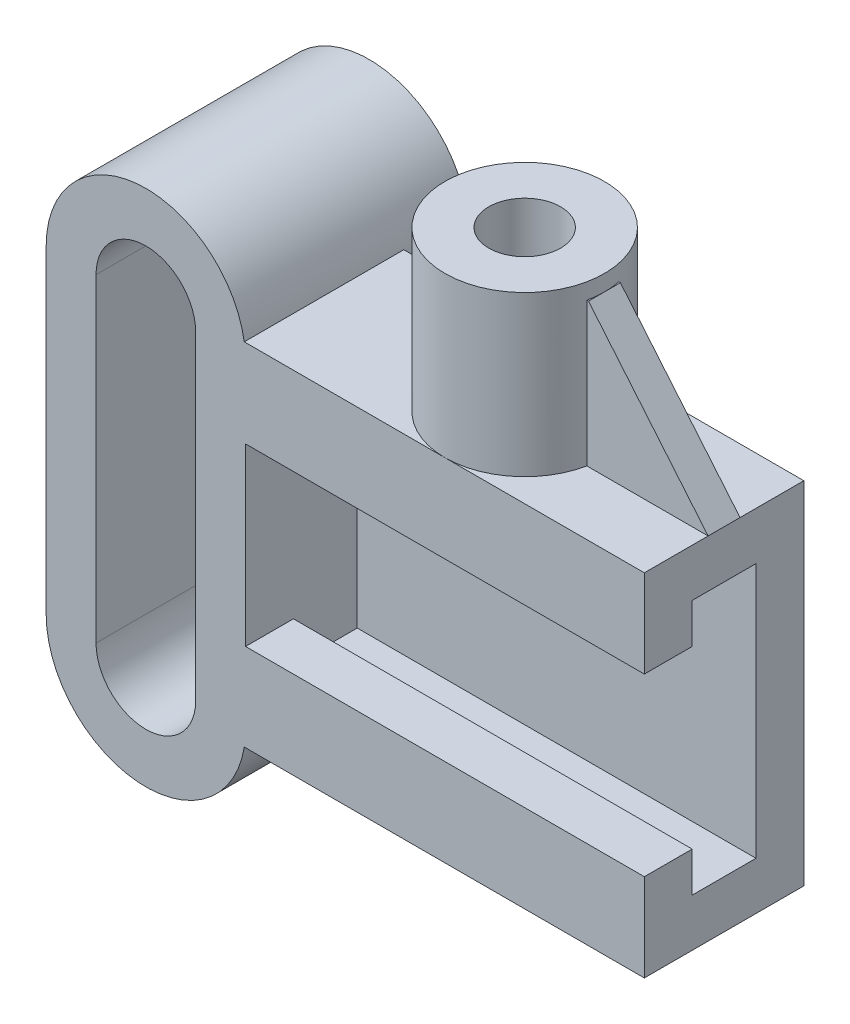
ISO-10303-21;
HEADER;
FILE_DESCRIPTION(('STEP AP214'),'2;1');
FILE_NAME('part.step','',(''),(''),'','','');
FILE_SCHEMA(('AUTOMOTIVE_DESIGN { 1 0 10303 214 1 1 1 1 }'));
ENDSEC;
DATA;
#1=APPLICATION_CONTEXT('core data for automotive mechanical design processes');
#2=APPLICATION_PROTOCOL_DEFINITION('international standard','automotive_design',2000,#1);
#3=PRODUCT_CONTEXT('',#1,'mechanical');
#4=PRODUCT('Part','Part','',(#3));
#5=PRODUCT_RELATED_PRODUCT_CATEGORY('part','',(#4));
#6=PRODUCT_DEFINITION_FORMATION('','',#4);
#7=PRODUCT_DEFINITION_CONTEXT('part definition',#1,'design');
#8=PRODUCT_DEFINITION('design','',#6,#7);
#9=PRODUCT_DEFINITION_SHAPE('','',#8);
#10=(LENGTH_UNIT() NAMED_UNIT(*) SI_UNIT(.MILLI.,.METRE.));
#11=(NAMED_UNIT(*) PLANE_ANGLE_UNIT() SI_UNIT($,.RADIAN.));
#12=(NAMED_UNIT(*) SI_UNIT($,.STERADIAN.) SOLID_ANGLE_UNIT());
#13=UNCERTAINTY_MEASURE_WITH_UNIT(LENGTH_MEASURE(1.E-05),#10,'distance_accuracy_value','');
#14=(GEOMETRIC_REPRESENTATION_CONTEXT(3) GLOBAL_UNCERTAINTY_ASSIGNED_CONTEXT((#13)) GLOBAL_UNIT_ASSIGNED_CONTEXT((#10,
#11,#12)) REPRESENTATION_CONTEXT('',''));
#15=CARTESIAN_POINT('',(0.,0.,0.));
#16=DIRECTION('',(0.,0.,1.));
#17=DIRECTION('',(1.,0.,0.));
#18=AXIS2_PLACEMENT_3D('',#15,#16,#17);
#19=CARTESIAN_POINT('',(62.5,22.,20.));
#20=DIRECTION('',(0.,-1.,0.));
#21=DIRECTION('',(0.,0.,-1.));
#22=AXIS2_PLACEMENT_3D('',#19,#20,#21);
#23=PLANE('',#22);
#24=DIRECTION('',(1.,0.,0.));
#25=VECTOR('',#24,1.);
#26=CARTESIAN_POINT('',(62.5,22.,7.99999999999999));
#27=LINE('',#26,#25);
#28=CARTESIAN_POINT('',(47.2979589711327,22.,7.99999999999999));
#29=VERTEX_POINT('',#28);
#30=CARTESIAN_POINT('',(62.5,22.,7.99999999999999));
#31=VERTEX_POINT('',#30);
#32=EDGE_CURVE('E69',#29,#31,#27,.T.);
#33=ORIENTED_EDGE('',*,*,#32,.T.);
#34=DIRECTION('',(0.,0.,1.));
#35=VECTOR('',#34,1.);
#36=CARTESIAN_POINT('',(62.5,22.,20.));
#37=LINE('',#36,#35);
#38=CARTESIAN_POINT('',(62.5,22.,0.));
#39=VERTEX_POINT('',#38);
#40=EDGE_CURVE('E430',#39,#31,#37,.T.);
#41=ORIENTED_EDGE('',*,*,#40,.F.);
#42=DIRECTION('',(-1.,0.,0.));
#43=VECTOR('',#42,1.);
#44=CARTESIAN_POINT('',(62.5,22.,0.));
#45=LINE('',#44,#43);
#46=CARTESIAN_POINT('',(37.5,22.,0.));
#47=VERTEX_POINT('',#46);
#48=EDGE_CURVE('E460',#39,#47,#45,.T.);
#49=ORIENTED_EDGE('',*,*,#48,.T.);
#50=CARTESIAN_POINT('',(37.5,22.,10.));
#51=DIRECTION('',(0.,1.,0.));
#52=DIRECTION('',(0.,0.,1.));
#53=AXIS2_PLACEMENT_3D('',#50,#51,#52);
#54=CIRCLE('',#53,10.);
#55=EDGE_CURVE('E275',#29,#47,#54,.T.);
#56=ORIENTED_EDGE('',*,*,#55,.F.);
#57=EDGE_LOOP('',(#33,#41,#49,#56));
#58=FACE_BOUND('',#57,.T.);
#59=ADVANCED_FACE('F45',(#58),#23,.F.);
#60=CARTESIAN_POINT('',(37.5,22.,20.));
#61=VERTEX_POINT('',#60);
#62=EDGE_CURVE('E265',#47,#61,#54,.T.);
#63=ORIENTED_EDGE('',*,*,#62,.F.);
#64=CARTESIAN_POINT('',(12.3389626792531,22.,0.));
#65=VERTEX_POINT('',#64);
#66=EDGE_CURVE('E459',#47,#65,#45,.T.);
#67=ORIENTED_EDGE('',*,*,#66,.T.);
#68=DIRECTION('',(0.,0.,1.));
#69=VECTOR('',#68,1.);
#70=CARTESIAN_POINT('',(12.3389626792531,22.,-8.00000000000001));
#71=LINE('',#70,#69);
#72=CARTESIAN_POINT('',(12.3389626792531,22.,20.));
#73=VERTEX_POINT('',#72);
#74=EDGE_CURVE('E393',#65,#73,#71,.T.);
#75=ORIENTED_EDGE('',*,*,#74,.T.);
#76=DIRECTION('',(-1.,0.,0.));
#77=VECTOR('',#76,1.);
#78=CARTESIAN_POINT('',(62.5,22.,20.));
#79=LINE('',#78,#77);
#80=EDGE_CURVE('E454',#61,#73,#79,.T.);
#81=ORIENTED_EDGE('',*,*,#80,.F.);
#82=EDGE_LOOP('',(#63,#67,#75,#81));
#83=FACE_BOUND('',#82,.T.);
#84=ADVANCED_FACE('F528',(#83),#23,.F.);
#85=CARTESIAN_POINT('',(62.5,16.,6.));
#86=DIRECTION('',(0.,1.,0.));
#87=DIRECTION('',(0.,0.,1.));
#88=AXIS2_PLACEMENT_3D('',#85,#86,#87);
#89=PLANE('',#88);
#90=DIRECTION('',(-1.,0.,0.));
#91=VECTOR('',#90,1.);
#92=CARTESIAN_POINT('',(62.5,16.,14.));
#93=LINE('',#92,#91);
#94=CARTESIAN_POINT('',(62.5,16.,14.));
#95=VERTEX_POINT('',#94);
#96=CARTESIAN_POINT('',(12.5,16.,14.));
#97=VERTEX_POINT('',#96);
#98=EDGE_CURVE('E442',#95,#97,#93,.T.);
#99=ORIENTED_EDGE('',*,*,#98,.T.);
#100=DIRECTION('',(0.,0.,-1.));
#101=VECTOR('',#100,1.);
#102=CARTESIAN_POINT('',(12.5,16.,6.));
#103=LINE('',#102,#101);
#104=CARTESIAN_POINT('',(12.5,16.,6.));
#105=VERTEX_POINT('',#104);
#106=EDGE_CURVE('E369',#97,#105,#103,.T.);
#107=ORIENTED_EDGE('',*,*,#106,.T.);
#108=DIRECTION('',(-1.,0.,0.));
#109=VECTOR('',#108,1.);
#110=CARTESIAN_POINT('',(62.5,16.,6.));
#111=LINE('',#110,#109);
#112=CARTESIAN_POINT('',(62.5,16.,6.));
#113=VERTEX_POINT('',#112);
#114=EDGE_CURVE('E488',#113,#105,#111,.T.);
#115=ORIENTED_EDGE('',*,*,#114,.F.);
#116=DIRECTION('',(0.,0.,-1.));
#117=VECTOR('',#116,1.);
#118=CARTESIAN_POINT('',(62.5,16.,6.));
#119=LINE('',#118,#117);
#120=EDGE_CURVE('E405',#95,#113,#119,.T.);
#121=ORIENTED_EDGE('',*,*,#120,.F.);
#122=EDGE_LOOP('',(#99,#107,#115,#121));
#123=FACE_BOUND('',#122,.T.);
#124=ADVANCED_FACE('F47',(#123),#89,.F.);
#125=CARTESIAN_POINT('',(62.5,-16.,5.99999999999999));
#126=DIRECTION('',(0.,0.,-1.));
#127=DIRECTION('',(0.,1.,0.));
#128=AXIS2_PLACEMENT_3D('',#125,#126,#127);
#129=PLANE('',#128);
#130=ORIENTED_EDGE('',*,*,#114,.T.);
#131=DIRECTION('',(0.,-1.,0.));
#132=VECTOR('',#131,1.);
#133=CARTESIAN_POINT('',(12.5,-16.,5.99999999999999));
#134=LINE('',#133,#132);
#135=CARTESIAN_POINT('',(12.5,-16.,5.99999999999999));
#136=VERTEX_POINT('',#135);
#137=EDGE_CURVE('E373',#105,#136,#134,.T.);
#138=ORIENTED_EDGE('',*,*,#137,.T.);
#139=DIRECTION('',(-1.,0.,0.));
#140=VECTOR('',#139,1.);
#141=CARTESIAN_POINT('',(62.5,-16.,5.99999999999999));
#142=LINE('',#141,#140);
#143=CARTESIAN_POINT('',(62.5,-16.,5.99999999999999));
#144=VERTEX_POINT('',#143);
#145=EDGE_CURVE('E484',#144,#136,#142,.T.);
#146=ORIENTED_EDGE('',*,*,#145,.F.);
#147=DIRECTION('',(0.,-1.,0.));
#148=VECTOR('',#147,1.);
#149=CARTESIAN_POINT('',(62.5,-16.,5.99999999999999));
#150=LINE('',#149,#148);
#151=EDGE_CURVE('E409',#113,#144,#150,.T.);
#152=ORIENTED_EDGE('',*,*,#151,.F.);
#153=EDGE_LOOP('',(#130,#138,#146,#152));
#154=FACE_BOUND('',#153,.T.);
#155=ADVANCED_FACE('F569',(#154),#129,.F.);
#156=CARTESIAN_POINT('',(62.5,-16.,14.));
#157=DIRECTION('',(0.,-1.,0.));
#158=DIRECTION('',(0.,0.,-1.));
#159=AXIS2_PLACEMENT_3D('',#156,#157,#158);
#160=PLANE('',#159);
#161=ORIENTED_EDGE('',*,*,#145,.T.);
#162=DIRECTION('',(0.,0.,1.));
#163=VECTOR('',#162,1.);
#164=CARTESIAN_POINT('',(12.5,-16.,14.));
#165=LINE('',#164,#163);
#166=CARTESIAN_POINT('',(12.5,-16.,14.));
#167=VERTEX_POINT('',#166);
#168=EDGE_CURVE('E377',#136,#167,#165,.T.);
#169=ORIENTED_EDGE('',*,*,#168,.T.);
#170=DIRECTION('',(-1.,0.,0.));
#171=VECTOR('',#170,1.);
#172=CARTESIAN_POINT('',(62.5,-16.,14.));
#173=LINE('',#172,#171);
#174=CARTESIAN_POINT('',(62.5,-16.,14.));
#175=VERTEX_POINT('',#174);
#176=EDGE_CURVE('E480',#175,#167,#173,.T.);
#177=ORIENTED_EDGE('',*,*,#176,.F.);
#178=DIRECTION('',(0.,0.,1.));
#179=VECTOR('',#178,1.);
#180=CARTESIAN_POINT('',(62.5,-16.,14.));
#181=LINE('',#180,#179);
#182=EDGE_CURVE('E412',#144,#175,#181,.T.);
#183=ORIENTED_EDGE('',*,*,#182,.F.);
#184=EDGE_LOOP('',(#161,#169,#177,#183));
#185=FACE_BOUND('',#184,.T.);
#186=ADVANCED_FACE('F566',(#185),#160,.F.);
#187=CARTESIAN_POINT('',(62.5,-11.,14.));
#188=DIRECTION('',(0.,0.,1.));
#189=DIRECTION('',(1.,0.,0.));
#190=AXIS2_PLACEMENT_3D('',#187,#188,#189);
#191=PLANE('',#190);
#192=ORIENTED_EDGE('',*,*,#176,.T.);
#193=DIRECTION('',(0.,1.,0.));
#194=VECTOR('',#193,1.);
#195=CARTESIAN_POINT('',(12.5,-11.,14.));
#196=LINE('',#195,#194);
#197=CARTESIAN_POINT('',(12.5,-11.,14.));
#198=VERTEX_POINT('',#197);
#199=EDGE_CURVE('E381',#167,#198,#196,.T.);
#200=ORIENTED_EDGE('',*,*,#199,.T.);
#201=DIRECTION('',(-1.,0.,0.));
#202=VECTOR('',#201,1.);
#203=CARTESIAN_POINT('',(62.5,-11.,14.));
#204=LINE('',#203,#202);
#205=CARTESIAN_POINT('',(62.5,-11.,14.));
#206=VERTEX_POINT('',#205);
#207=EDGE_CURVE('E476',#206,#198,#204,.T.);
#208=ORIENTED_EDGE('',*,*,#207,.F.);
#209=DIRECTION('',(0.,1.,0.));
#210=VECTOR('',#209,1.);
#211=CARTESIAN_POINT('',(62.5,-11.,14.));
#212=LINE('',#211,#210);
#213=EDGE_CURVE('E415',#175,#206,#212,.T.);
#214=ORIENTED_EDGE('',*,*,#213,.F.);
#215=EDGE_LOOP('',(#192,#200,#208,#214));
#216=FACE_BOUND('',#215,.T.);
#217=ADVANCED_FACE('F561',(#216),#191,.F.);
#218=CARTESIAN_POINT('',(62.5,-11.,20.));
#219=DIRECTION('',(0.,-1.,0.));
#220=DIRECTION('',(0.,0.,-1.));
#221=AXIS2_PLACEMENT_3D('',#218,#219,#220);
#222=PLANE('',#221);
#223=ORIENTED_EDGE('',*,*,#207,.T.);
#224=DIRECTION('',(0.,0.,1.));
#225=VECTOR('',#224,1.);
#226=CARTESIAN_POINT('',(12.5,-11.,20.));
#227=LINE('',#226,#225);
#228=CARTESIAN_POINT('',(12.5,-11.,20.));
#229=VERTEX_POINT('',#228);
#230=EDGE_CURVE('E385',#198,#229,#227,.T.);
#231=ORIENTED_EDGE('',*,*,#230,.T.);
#232=DIRECTION('',(-1.,0.,0.));
#233=VECTOR('',#232,1.);
#234=CARTESIAN_POINT('',(62.5,-11.,20.));
#235=LINE('',#234,#233);
#236=CARTESIAN_POINT('',(62.5,-11.,20.));
#237=VERTEX_POINT('',#236);
#238=EDGE_CURVE('E472',#237,#229,#235,.T.);
#239=ORIENTED_EDGE('',*,*,#238,.F.);
#240=DIRECTION('',(0.,0.,1.));
#241=VECTOR('',#240,1.);
#242=CARTESIAN_POINT('',(62.5,-11.,20.));
#243=LINE('',#242,#241);
#244=EDGE_CURVE('E418',#206,#237,#243,.T.);
#245=ORIENTED_EDGE('',*,*,#244,.F.);
#246=EDGE_LOOP('',(#223,#231,#239,#245));
#247=FACE_BOUND('',#246,.T.);
#248=ADVANCED_FACE('F556',(#247),#222,.F.);
#249=CARTESIAN_POINT('',(62.5,-22.,0.));
#250=DIRECTION('',(0.,1.,0.));
#251=DIRECTION('',(0.,0.,1.));
#252=AXIS2_PLACEMENT_3D('',#249,#250,#251);
#253=PLANE('',#252);
#254=DIRECTION('',(-1.,0.,0.));
#255=VECTOR('',#254,1.);
#256=CARTESIAN_POINT('',(62.5,-22.,20.));
#257=LINE('',#256,#255);
#258=CARTESIAN_POINT('',(62.5,-22.,20.));
#259=VERTEX_POINT('',#258);
#260=CARTESIAN_POINT('',(12.3389626792531,-22.,20.));
#261=VERTEX_POINT('',#260);
#262=EDGE_CURVE('E468',#259,#261,#257,.T.);
#263=ORIENTED_EDGE('',*,*,#262,.T.);
#264=DIRECTION('',(0.,0.,1.));
#265=VECTOR('',#264,1.);
#266=CARTESIAN_POINT('',(12.3389626792531,-22.,-8.00000000000001));
#267=LINE('',#266,#265);
#268=CARTESIAN_POINT('',(12.3389626792531,-22.,0.));
#269=VERTEX_POINT('',#268);
#270=EDGE_CURVE('E401',#261,#269,#267,.F.);
#271=ORIENTED_EDGE('',*,*,#270,.T.);
#272=DIRECTION('',(-1.,0.,0.));
#273=VECTOR('',#272,1.);
#274=CARTESIAN_POINT('',(62.5,-22.,0.));
#275=LINE('',#274,#273);
#276=CARTESIAN_POINT('',(62.5,-22.,0.));
#277=VERTEX_POINT('',#276);
#278=EDGE_CURVE('E464',#277,#269,#275,.T.);
#279=ORIENTED_EDGE('',*,*,#278,.F.);
#280=DIRECTION('',(0.,0.,-1.));
#281=VECTOR('',#280,1.);
#282=CARTESIAN_POINT('',(62.5,-22.,0.));
#283=LINE('',#282,#281);
#284=EDGE_CURVE('E424',#259,#277,#283,.T.);
#285=ORIENTED_EDGE('',*,*,#284,.F.);
#286=EDGE_LOOP('',(#263,#271,#279,#285));
#287=FACE_BOUND('',#286,.T.);
#288=ADVANCED_FACE('F550',(#287),#253,.F.);
#289=CARTESIAN_POINT('',(62.5,22.,0.));
#290=DIRECTION('',(0.,0.,1.));
#291=DIRECTION('',(0.,-1.,0.));
#292=AXIS2_PLACEMENT_3D('',#289,#290,#291);
#293=PLANE('',#292);
#294=DIRECTION('',(0.,1.,0.));
#295=VECTOR('',#294,1.);
#296=CARTESIAN_POINT('',(12.5,22.,0.));
#297=LINE('',#296,#295);
#298=CARTESIAN_POINT('',(12.5,-20.,0.));
#299=VERTEX_POINT('',#298);
#300=CARTESIAN_POINT('',(12.5,20.,0.));
#301=VERTEX_POINT('',#300);
#302=EDGE_CURVE('E389',#299,#301,#297,.T.);
#303=ORIENTED_EDGE('',*,*,#302,.T.);
#304=CARTESIAN_POINT('',(0.,20.,0.));
#305=DIRECTION('',(0.,0.,1.));
#306=DIRECTION('',(0.,-1.,0.));
#307=AXIS2_PLACEMENT_3D('',#304,#305,#306);
#308=CIRCLE('',#307,12.5);
#309=EDGE_CURVE('E397',#301,#65,#308,.T.);
#310=ORIENTED_EDGE('',*,*,#309,.T.);
#311=ORIENTED_EDGE('',*,*,#66,.F.);
#312=ORIENTED_EDGE('',*,*,#48,.F.);
#313=DIRECTION('',(0.,1.,0.));
#314=VECTOR('',#313,1.);
#315=CARTESIAN_POINT('',(62.5,22.,0.));
#316=LINE('',#315,#314);
#317=EDGE_CURVE('E427',#277,#39,#316,.T.);
#318=ORIENTED_EDGE('',*,*,#317,.F.);
#319=ORIENTED_EDGE('',*,*,#278,.T.);
#320=CARTESIAN_POINT('',(0.,-20.,0.));
#321=DIRECTION('',(0.,0.,1.));
#322=DIRECTION('',(0.,-1.,0.));
#323=AXIS2_PLACEMENT_3D('',#320,#321,#322);
#324=CIRCLE('',#323,12.5);
#325=EDGE_CURVE('E496',#269,#299,#324,.T.);
#326=ORIENTED_EDGE('',*,*,#325,.T.);
#327=EDGE_LOOP('',(#303,#310,#311,#312,#318,#319,#326));
#328=FACE_BOUND('',#327,.T.);
#329=ADVANCED_FACE('F522',(#328),#293,.F.);
#330=CARTESIAN_POINT('',(62.5,22.,12.));
#331=VERTEX_POINT('',#330);
#332=CARTESIAN_POINT('',(62.5,22.,20.));
#333=VERTEX_POINT('',#332);
#334=EDGE_CURVE('E61',#331,#333,#37,.T.);
#335=ORIENTED_EDGE('',*,*,#334,.F.);
#336=DIRECTION('',(1.,0.,0.));
#337=VECTOR('',#336,1.);
#338=CARTESIAN_POINT('',(46.5,22.,12.));
#339=LINE('',#338,#337);
#340=CARTESIAN_POINT('',(47.2979589711327,22.,12.));
#341=VERTEX_POINT('',#340);
#342=EDGE_CURVE('E224',#341,#331,#339,.T.);
#343=ORIENTED_EDGE('',*,*,#342,.F.);
#344=EDGE_CURVE('E271',#61,#341,#54,.T.);
#345=ORIENTED_EDGE('',*,*,#344,.F.);
#346=EDGE_CURVE('E455',#333,#61,#79,.T.);
#347=ORIENTED_EDGE('',*,*,#346,.F.);
#348=EDGE_LOOP('',(#335,#343,#345,#347));
#349=FACE_BOUND('',#348,.T.);
#350=ADVANCED_FACE('F589',(#349),#23,.F.);
#351=CARTESIAN_POINT('',(62.5,11.,20.));
#352=DIRECTION('',(0.,0.,-1.));
#353=DIRECTION('',(0.,1.,0.));
#354=AXIS2_PLACEMENT_3D('',#351,#352,#353);
#355=PLANE('',#354);
#356=DIRECTION('',(0.,-1.,0.));
#357=VECTOR('',#356,1.);
#358=CARTESIAN_POINT('',(-6.25,20.,20.));
#359=LINE('',#358,#357);
#360=CARTESIAN_POINT('',(-6.25000000000001,20.,20.));
#361=VERTEX_POINT('',#360);
#362=CARTESIAN_POINT('',(-6.24999999999999,-20.,20.));
#363=VERTEX_POINT('',#362);
#364=EDGE_CURVE('E296',#361,#363,#359,.T.);
#365=ORIENTED_EDGE('',*,*,#364,.F.);
#366=CARTESIAN_POINT('',(0.,20.,20.));
#367=DIRECTION('',(0.,0.,1.));
#368=DIRECTION('',(1.,0.,0.));
#369=AXIS2_PLACEMENT_3D('',#366,#367,#368);
#370=CIRCLE('',#369,6.24999999999999);
#371=CARTESIAN_POINT('',(6.24999999999999,20.,20.));
#372=VERTEX_POINT('',#371);
#373=EDGE_CURVE('E270',#372,#361,#370,.T.);
#374=ORIENTED_EDGE('',*,*,#373,.F.);
#375=DIRECTION('',(0.,1.,0.));
#376=VECTOR('',#375,1.);
#377=CARTESIAN_POINT('',(6.24999999999999,20.,20.));
#378=LINE('',#377,#376);
#379=CARTESIAN_POINT('',(6.25,-20.,20.));
#380=VERTEX_POINT('',#379);
#381=EDGE_CURVE('E281',#380,#372,#378,.T.);
#382=ORIENTED_EDGE('',*,*,#381,.F.);
#383=CARTESIAN_POINT('',(0.,-20.,20.));
#384=DIRECTION('',(0.,0.,1.));
#385=DIRECTION('',(1.,0.,0.));
#386=AXIS2_PLACEMENT_3D('',#383,#384,#385);
#387=CIRCLE('',#386,6.24999999999999);
#388=EDGE_CURVE('E300',#363,#380,#387,.T.);
#389=ORIENTED_EDGE('',*,*,#388,.F.);
#390=EDGE_LOOP('',(#365,#374,#382,#389));
#391=FACE_BOUND('',#390,.T.);
#392=CARTESIAN_POINT('',(0.,-20.,20.));
#393=DIRECTION('',(0.,0.,1.));
#394=DIRECTION('',(1.,0.,0.));
#395=AXIS2_PLACEMENT_3D('',#392,#393,#394);
#396=CIRCLE('',#395,12.5);
#397=CARTESIAN_POINT('',(-12.5,-20.,20.));
#398=VERTEX_POINT('',#397);
#399=EDGE_CURVE('E344',#398,#261,#396,.T.);
#400=ORIENTED_EDGE('',*,*,#399,.T.);
#401=ORIENTED_EDGE('',*,*,#262,.F.);
#402=DIRECTION('',(0.,-1.,0.));
#403=VECTOR('',#402,1.);
#404=CARTESIAN_POINT('',(62.5,-22.,20.));
#405=LINE('',#404,#403);
#406=EDGE_CURVE('E421',#237,#259,#405,.T.);
#407=ORIENTED_EDGE('',*,*,#406,.F.);
#408=ORIENTED_EDGE('',*,*,#238,.T.);
#409=DIRECTION('',(0.,1.,0.));
#410=VECTOR('',#409,1.);
#411=CARTESIAN_POINT('',(12.5,20.,20.));
#412=LINE('',#411,#410);
#413=CARTESIAN_POINT('',(12.5,11.,20.));
#414=VERTEX_POINT('',#413);
#415=EDGE_CURVE('E325',#229,#414,#412,.T.);
#416=ORIENTED_EDGE('',*,*,#415,.T.);
#417=DIRECTION('',(-1.,0.,0.));
#418=VECTOR('',#417,1.);
#419=CARTESIAN_POINT('',(62.5,11.,20.));
#420=LINE('',#419,#418);
#421=CARTESIAN_POINT('',(62.5,11.,20.));
#422=VERTEX_POINT('',#421);
#423=EDGE_CURVE('E450',#422,#414,#420,.T.);
#424=ORIENTED_EDGE('',*,*,#423,.F.);
#425=DIRECTION('',(0.,-1.,0.));
#426=VECTOR('',#425,1.);
#427=CARTESIAN_POINT('',(62.5,11.,20.));
#428=LINE('',#427,#426);
#429=EDGE_CURVE('E433',#333,#422,#428,.T.);
#430=ORIENTED_EDGE('',*,*,#429,.F.);
#431=ORIENTED_EDGE('',*,*,#346,.T.);
#432=ORIENTED_EDGE('',*,*,#80,.T.);
#433=CARTESIAN_POINT('',(0.,20.,20.));
#434=DIRECTION('',(0.,0.,1.));
#435=DIRECTION('',(1.,0.,0.));
#436=AXIS2_PLACEMENT_3D('',#433,#434,#435);
#437=CIRCLE('',#436,12.5);
#438=CARTESIAN_POINT('',(-12.5,20.,20.));
#439=VERTEX_POINT('',#438);
#440=EDGE_CURVE('E310',#73,#439,#437,.T.);
#441=ORIENTED_EDGE('',*,*,#440,.T.);
#442=DIRECTION('',(0.,-1.,0.));
#443=VECTOR('',#442,1.);
#444=CARTESIAN_POINT('',(-12.5,20.,20.));
#445=LINE('',#444,#443);
#446=EDGE_CURVE('E340',#439,#398,#445,.T.);
#447=ORIENTED_EDGE('',*,*,#446,.T.);
#448=EDGE_LOOP('',(#400,#401,#407,#408,#416,#424,#430,#431,#432,#441,#447));
#449=FACE_BOUND('',#448,.T.);
#450=ADVANCED_FACE('F535',(#391,#449),#355,.F.);
#451=CARTESIAN_POINT('',(62.5,11.,14.));
#452=DIRECTION('',(0.,1.,0.));
#453=DIRECTION('',(0.,0.,1.));
#454=AXIS2_PLACEMENT_3D('',#451,#452,#453);
#455=PLANE('',#454);
#456=ORIENTED_EDGE('',*,*,#423,.T.);
#457=DIRECTION('',(0.,0.,-1.));
#458=VECTOR('',#457,1.);
#459=CARTESIAN_POINT('',(12.5,11.,14.));
#460=LINE('',#459,#458);
#461=CARTESIAN_POINT('',(12.5,11.,14.));
#462=VERTEX_POINT('',#461);
#463=EDGE_CURVE('E355',#414,#462,#460,.T.);
#464=ORIENTED_EDGE('',*,*,#463,.T.);
#465=DIRECTION('',(-1.,0.,0.));
#466=VECTOR('',#465,1.);
#467=CARTESIAN_POINT('',(62.5,11.,14.));
#468=LINE('',#467,#466);
#469=CARTESIAN_POINT('',(62.5,11.,14.));
#470=VERTEX_POINT('',#469);
#471=EDGE_CURVE('E446',#470,#462,#468,.T.);
#472=ORIENTED_EDGE('',*,*,#471,.F.);
#473=DIRECTION('',(0.,0.,-1.));
#474=VECTOR('',#473,1.);
#475=CARTESIAN_POINT('',(62.5,11.,14.));
#476=LINE('',#475,#474);
#477=EDGE_CURVE('E436',#422,#470,#476,.T.);
#478=ORIENTED_EDGE('',*,*,#477,.F.);
#479=EDGE_LOOP('',(#456,#464,#472,#478));
#480=FACE_BOUND('',#479,.T.);
#481=ADVANCED_FACE('F580',(#480),#455,.F.);
#482=CARTESIAN_POINT('',(62.5,16.,14.));
#483=DIRECTION('',(0.,0.,1.));
#484=DIRECTION('',(1.,0.,0.));
#485=AXIS2_PLACEMENT_3D('',#482,#483,#484);
#486=PLANE('',#485);
#487=ORIENTED_EDGE('',*,*,#471,.T.);
#488=DIRECTION('',(0.,1.,0.));
#489=VECTOR('',#488,1.);
#490=CARTESIAN_POINT('',(12.5,16.,14.));
#491=LINE('',#490,#489);
#492=EDGE_CURVE('E492',#462,#97,#491,.T.);
#493=ORIENTED_EDGE('',*,*,#492,.T.);
#494=ORIENTED_EDGE('',*,*,#98,.F.);
#495=DIRECTION('',(0.,1.,0.));
#496=VECTOR('',#495,1.);
#497=CARTESIAN_POINT('',(62.5,16.,14.));
#498=LINE('',#497,#496);
#499=EDGE_CURVE('E439',#470,#95,#498,.T.);
#500=ORIENTED_EDGE('',*,*,#499,.F.);
#501=EDGE_LOOP('',(#487,#493,#494,#500));
#502=FACE_BOUND('',#501,.T.);
#503=ADVANCED_FACE('F575',(#502),#486,.F.);
#504=CARTESIAN_POINT('',(62.5,0.,0.));
#505=DIRECTION('',(1.,0.,0.));
#506=DIRECTION('',(0.,0.,-1.));
#507=AXIS2_PLACEMENT_3D('',#504,#505,#506);
#508=PLANE('',#507);
#509=ORIENTED_EDGE('',*,*,#120,.T.);
#510=ORIENTED_EDGE('',*,*,#151,.T.);
#511=ORIENTED_EDGE('',*,*,#182,.T.);
#512=ORIENTED_EDGE('',*,*,#213,.T.);
#513=ORIENTED_EDGE('',*,*,#244,.T.);
#514=ORIENTED_EDGE('',*,*,#406,.T.);
#515=ORIENTED_EDGE('',*,*,#284,.T.);
#516=ORIENTED_EDGE('',*,*,#317,.T.);
#517=ORIENTED_EDGE('',*,*,#40,.T.);
#518=DIRECTION('',(0.,0.,-1.));
#519=VECTOR('',#518,1.);
#520=CARTESIAN_POINT('',(62.5,22.,12.));
#521=LINE('',#520,#519);
#522=EDGE_CURVE('E238',#331,#31,#521,.T.);
#523=ORIENTED_EDGE('',*,*,#522,.F.);
#524=ORIENTED_EDGE('',*,*,#334,.T.);
#525=ORIENTED_EDGE('',*,*,#429,.T.);
#526=ORIENTED_EDGE('',*,*,#477,.T.);
#527=ORIENTED_EDGE('',*,*,#499,.T.);
#528=EDGE_LOOP('',(#509,#510,#511,#512,#513,#514,#515,#516,#517,#523,#524,#525,#526,#527));
#529=FACE_BOUND('',#528,.T.);
#530=ADVANCED_FACE('F516',(#529),#508,.T.);
#531=CARTESIAN_POINT('',(0.,-20.,-8.00000000000001));
#532=DIRECTION('',(0.,0.,1.));
#533=DIRECTION('',(1.,0.,0.));
#534=AXIS2_PLACEMENT_3D('',#531,#532,#533);
#535=CYLINDRICAL_SURFACE('',#534,12.5);
#536=ORIENTED_EDGE('',*,*,#270,.F.);
#537=ORIENTED_EDGE('',*,*,#399,.F.);
#538=DIRECTION('',(0.,0.,1.));
#539=VECTOR('',#538,1.);
#540=CARTESIAN_POINT('',(-12.5,-20.,-8.00000000000001));
#541=LINE('',#540,#539);
#542=CARTESIAN_POINT('',(-12.5,-20.,-8.00000000000001));
#543=VERTEX_POINT('',#542);
#544=EDGE_CURVE('E360',#543,#398,#541,.T.);
#545=ORIENTED_EDGE('',*,*,#544,.F.);
#546=CARTESIAN_POINT('',(0.,-20.,-8.00000000000001));
#547=DIRECTION('',(0.,0.,1.));
#548=DIRECTION('',(1.,0.,0.));
#549=AXIS2_PLACEMENT_3D('',#546,#547,#548);
#550=CIRCLE('',#549,12.5);
#551=CARTESIAN_POINT('',(12.5,-20.,-8.00000000000001));
#552=VERTEX_POINT('',#551);
#553=EDGE_CURVE('E329',#543,#552,#550,.T.);
#554=ORIENTED_EDGE('',*,*,#553,.T.);
#555=DIRECTION('',(0.,0.,1.));
#556=VECTOR('',#555,1.);
#557=CARTESIAN_POINT('',(12.5,-20.,-8.00000000000001));
#558=LINE('',#557,#556);
#559=EDGE_CURVE('E356',#552,#299,#558,.T.);
#560=ORIENTED_EDGE('',*,*,#559,.T.);
#561=ORIENTED_EDGE('',*,*,#325,.F.);
#562=EDGE_LOOP('',(#536,#537,#545,#554,#560,#561));
#563=FACE_BOUND('',#562,.T.);
#564=ADVANCED_FACE('F683',(#563),#535,.T.);
#565=CARTESIAN_POINT('',(0.,20.,-8.00000000000001));
#566=DIRECTION('',(0.,0.,1.));
#567=DIRECTION('',(1.,0.,0.));
#568=AXIS2_PLACEMENT_3D('',#565,#566,#567);
#569=CYLINDRICAL_SURFACE('',#568,12.5);
#570=ORIENTED_EDGE('',*,*,#309,.F.);
#571=DIRECTION('',(0.,0.,1.));
#572=VECTOR('',#571,1.);
#573=CARTESIAN_POINT('',(12.5,20.,-8.00000000000001));
#574=LINE('',#573,#572);
#575=CARTESIAN_POINT('',(12.5,20.,-8.00000000000001));
#576=VERTEX_POINT('',#575);
#577=EDGE_CURVE('E351',#576,#301,#574,.T.);
#578=ORIENTED_EDGE('',*,*,#577,.F.);
#579=CARTESIAN_POINT('',(0.,20.,-8.00000000000001));
#580=DIRECTION('',(0.,0.,1.));
#581=DIRECTION('',(1.,0.,0.));
#582=AXIS2_PLACEMENT_3D('',#579,#580,#581);
#583=CIRCLE('',#582,12.5);
#584=CARTESIAN_POINT('',(-12.5,20.,-8.00000000000001));
#585=VERTEX_POINT('',#584);
#586=EDGE_CURVE('E320',#576,#585,#583,.T.);
#587=ORIENTED_EDGE('',*,*,#586,.T.);
#588=DIRECTION('',(0.,0.,1.));
#589=VECTOR('',#588,1.);
#590=CARTESIAN_POINT('',(-12.5,20.,-8.00000000000001));
#591=LINE('',#590,#589);
#592=EDGE_CURVE('E337',#585,#439,#591,.T.);
#593=ORIENTED_EDGE('',*,*,#592,.T.);
#594=ORIENTED_EDGE('',*,*,#440,.F.);
#595=ORIENTED_EDGE('',*,*,#74,.F.);
#596=EDGE_LOOP('',(#570,#578,#587,#593,#594,#595));
#597=FACE_BOUND('',#596,.T.);
#598=ADVANCED_FACE('F538',(#597),#569,.T.);
#599=CARTESIAN_POINT('',(12.5,20.,-8.00000000000001));
#600=DIRECTION('',(1.,0.,0.));
#601=DIRECTION('',(0.,1.,0.));
#602=AXIS2_PLACEMENT_3D('',#599,#600,#601);
#603=PLANE('',#602);
#604=ORIENTED_EDGE('',*,*,#302,.F.);
#605=ORIENTED_EDGE('',*,*,#559,.F.);
#606=DIRECTION('',(0.,1.,0.));
#607=VECTOR('',#606,1.);
#608=CARTESIAN_POINT('',(12.5,20.,-8.00000000000001));
#609=LINE('',#608,#607);
#610=EDGE_CURVE('E333',#552,#576,#609,.T.);
#611=ORIENTED_EDGE('',*,*,#610,.T.);
#612=ORIENTED_EDGE('',*,*,#577,.T.);
#613=EDGE_LOOP('',(#604,#605,#611,#612));
#614=FACE_BOUND('',#613,.T.);
#615=ADVANCED_FACE('F829',(#614),#603,.T.);
#616=ORIENTED_EDGE('',*,*,#230,.F.);
#617=ORIENTED_EDGE('',*,*,#199,.F.);
#618=ORIENTED_EDGE('',*,*,#168,.F.);
#619=ORIENTED_EDGE('',*,*,#137,.F.);
#620=ORIENTED_EDGE('',*,*,#106,.F.);
#621=ORIENTED_EDGE('',*,*,#492,.F.);
#622=ORIENTED_EDGE('',*,*,#463,.F.);
#623=ORIENTED_EDGE('',*,*,#415,.F.);
#624=EDGE_LOOP('',(#616,#617,#618,#619,#620,#621,#622,#623));
#625=FACE_BOUND('',#624,.T.);
#626=ADVANCED_FACE('F559',(#625),#603,.T.);
#627=CARTESIAN_POINT('',(-12.5,20.,-8.00000000000001));
#628=DIRECTION('',(-1.,0.,0.));
#629=DIRECTION('',(0.,-1.,0.));
#630=AXIS2_PLACEMENT_3D('',#627,#628,#629);
#631=PLANE('',#630);
#632=ORIENTED_EDGE('',*,*,#446,.F.);
#633=ORIENTED_EDGE('',*,*,#592,.F.);
#634=DIRECTION('',(0.,-1.,0.));
#635=VECTOR('',#634,1.);
#636=CARTESIAN_POINT('',(-12.5,20.,-8.00000000000001));
#637=LINE('',#636,#635);
#638=EDGE_CURVE('E324',#585,#543,#637,.T.);
#639=ORIENTED_EDGE('',*,*,#638,.T.);
#640=ORIENTED_EDGE('',*,*,#544,.T.);
#641=EDGE_LOOP('',(#632,#633,#639,#640));
#642=FACE_BOUND('',#641,.T.);
#643=ADVANCED_FACE('F543',(#642),#631,.T.);
#644=CARTESIAN_POINT('',(0.,20.,-8.00000000000001));
#645=DIRECTION('',(0.,0.,1.));
#646=DIRECTION('',(1.,0.,0.));
#647=AXIS2_PLACEMENT_3D('',#644,#645,#646);
#648=PLANE('',#647);
#649=DIRECTION('',(0.,1.,0.));
#650=VECTOR('',#649,1.);
#651=CARTESIAN_POINT('',(6.24999999999999,20.,-8.00000000000001));
#652=LINE('',#651,#650);
#653=CARTESIAN_POINT('',(6.25,-20.,-8.00000000000001));
#654=VERTEX_POINT('',#653);
#655=CARTESIAN_POINT('',(6.24999999999999,20.,-8.00000000000001));
#656=VERTEX_POINT('',#655);
#657=EDGE_CURVE('E289',#654,#656,#652,.T.);
#658=ORIENTED_EDGE('',*,*,#657,.T.);
#659=CARTESIAN_POINT('',(0.,20.,-8.00000000000001));
#660=DIRECTION('',(0.,0.,1.));
#661=DIRECTION('',(1.,0.,0.));
#662=AXIS2_PLACEMENT_3D('',#659,#660,#661);
#663=CIRCLE('',#662,6.24999999999999);
#664=CARTESIAN_POINT('',(-6.25,20.,-8.00000000000001));
#665=VERTEX_POINT('',#664);
#666=EDGE_CURVE('E276',#656,#665,#663,.T.);
#667=ORIENTED_EDGE('',*,*,#666,.T.);
#668=DIRECTION('',(0.,-1.,0.));
#669=VECTOR('',#668,1.);
#670=CARTESIAN_POINT('',(-6.25,20.,-8.00000000000001));
#671=LINE('',#670,#669);
#672=CARTESIAN_POINT('',(-6.24999999999999,-20.,-8.00000000000001));
#673=VERTEX_POINT('',#672);
#674=EDGE_CURVE('E280',#665,#673,#671,.T.);
#675=ORIENTED_EDGE('',*,*,#674,.T.);
#676=CARTESIAN_POINT('',(0.,-20.,-8.00000000000001));
#677=DIRECTION('',(0.,0.,1.));
#678=DIRECTION('',(1.,0.,0.));
#679=AXIS2_PLACEMENT_3D('',#676,#677,#678);
#680=CIRCLE('',#679,6.24999999999999);
#681=EDGE_CURVE('E285',#673,#654,#680,.T.);
#682=ORIENTED_EDGE('',*,*,#681,.T.);
#683=EDGE_LOOP('',(#658,#667,#675,#682));
#684=FACE_BOUND('',#683,.T.);
#685=ORIENTED_EDGE('',*,*,#586,.F.);
#686=ORIENTED_EDGE('',*,*,#610,.F.);
#687=ORIENTED_EDGE('',*,*,#553,.F.);
#688=ORIENTED_EDGE('',*,*,#638,.F.);
#689=EDGE_LOOP('',(#685,#686,#687,#688));
#690=FACE_BOUND('',#689,.T.);
#691=ADVANCED_FACE('F805',(#684,#690),#648,.F.);
#692=CARTESIAN_POINT('',(0.,20.,-8.00000000000001));
#693=DIRECTION('',(0.,0.,1.));
#694=DIRECTION('',(1.,0.,0.));
#695=AXIS2_PLACEMENT_3D('',#692,#693,#694);
#696=CYLINDRICAL_SURFACE('',#695,6.24999999999999);
#697=ORIENTED_EDGE('',*,*,#373,.T.);
#698=DIRECTION('',(0.,0.,1.));
#699=VECTOR('',#698,1.);
#700=CARTESIAN_POINT('',(-6.25,20.,-8.00000000000001));
#701=LINE('',#700,#699);
#702=EDGE_CURVE('E293',#665,#361,#701,.T.);
#703=ORIENTED_EDGE('',*,*,#702,.F.);
#704=ORIENTED_EDGE('',*,*,#666,.F.);
#705=DIRECTION('',(0.,0.,1.));
#706=VECTOR('',#705,1.);
#707=CARTESIAN_POINT('',(6.24999999999999,20.,-8.00000000000001));
#708=LINE('',#707,#706);
#709=EDGE_CURVE('E307',#656,#372,#708,.T.);
#710=ORIENTED_EDGE('',*,*,#709,.T.);
#711=EDGE_LOOP('',(#697,#703,#704,#710));
#712=FACE_BOUND('',#711,.T.);
#713=ADVANCED_FACE('F796',(#712),#696,.F.);
#714=CARTESIAN_POINT('',(6.24999999999999,20.,-8.00000000000001));
#715=DIRECTION('',(1.,0.,0.));
#716=DIRECTION('',(0.,1.,0.));
#717=AXIS2_PLACEMENT_3D('',#714,#715,#716);
#718=PLANE('',#717);
#719=ORIENTED_EDGE('',*,*,#381,.T.);
#720=ORIENTED_EDGE('',*,*,#709,.F.);
#721=ORIENTED_EDGE('',*,*,#657,.F.);
#722=DIRECTION('',(0.,0.,1.));
#723=VECTOR('',#722,1.);
#724=CARTESIAN_POINT('',(6.25,-20.,-8.00000000000001));
#725=LINE('',#724,#723);
#726=EDGE_CURVE('E311',#654,#380,#725,.T.);
#727=ORIENTED_EDGE('',*,*,#726,.T.);
#728=EDGE_LOOP('',(#719,#720,#721,#727));
#729=FACE_BOUND('',#728,.T.);
#730=ADVANCED_FACE('F787',(#729),#718,.F.);
#731=CARTESIAN_POINT('',(0.,-20.,-8.00000000000001));
#732=DIRECTION('',(0.,0.,1.));
#733=DIRECTION('',(1.,0.,0.));
#734=AXIS2_PLACEMENT_3D('',#731,#732,#733);
#735=CYLINDRICAL_SURFACE('',#734,6.24999999999999);
#736=ORIENTED_EDGE('',*,*,#388,.T.);
#737=ORIENTED_EDGE('',*,*,#726,.F.);
#738=ORIENTED_EDGE('',*,*,#681,.F.);
#739=DIRECTION('',(0.,0.,1.));
#740=VECTOR('',#739,1.);
#741=CARTESIAN_POINT('',(-6.24999999999999,-20.,-8.00000000000001));
#742=LINE('',#741,#740);
#743=EDGE_CURVE('E314',#673,#363,#742,.T.);
#744=ORIENTED_EDGE('',*,*,#743,.T.);
#745=EDGE_LOOP('',(#736,#737,#738,#744));
#746=FACE_BOUND('',#745,.T.);
#747=ADVANCED_FACE('F778',(#746),#735,.F.);
#748=CARTESIAN_POINT('',(-6.25,20.,-8.00000000000001));
#749=DIRECTION('',(-1.,0.,0.));
#750=DIRECTION('',(0.,-1.,0.));
#751=AXIS2_PLACEMENT_3D('',#748,#749,#750);
#752=PLANE('',#751);
#753=ORIENTED_EDGE('',*,*,#364,.T.);
#754=ORIENTED_EDGE('',*,*,#743,.F.);
#755=ORIENTED_EDGE('',*,*,#674,.F.);
#756=ORIENTED_EDGE('',*,*,#702,.T.);
#757=EDGE_LOOP('',(#753,#754,#755,#756));
#758=FACE_BOUND('',#757,.T.);
#759=ADVANCED_FACE('F693',(#758),#752,.F.);
#760=CARTESIAN_POINT('',(37.5,42.,10.));
#761=DIRECTION('',(0.,-1.,0.));
#762=DIRECTION('',(0.,0.,-1.));
#763=AXIS2_PLACEMENT_3D('',#760,#761,#762);
#764=CYLINDRICAL_SURFACE('',#763,10.);
#765=CARTESIAN_POINT('',(37.5,42.,10.));
#766=DIRECTION('',(0.,1.,0.));
#767=DIRECTION('',(0.,0.,1.));
#768=AXIS2_PLACEMENT_3D('',#765,#766,#767);
#769=CIRCLE('',#768,10.);
#770=CARTESIAN_POINT('',(37.5,42.,20.));
#771=VERTEX_POINT('',#770);
#772=EDGE_CURVE('E266',#771,#771,#769,.T.);
#773=ORIENTED_EDGE('',*,*,#772,.F.);
#774=EDGE_LOOP('',(#773));
#775=FACE_BOUND('',#774,.T.);
#776=ORIENTED_EDGE('',*,*,#344,.T.);
#777=DIRECTION('',(0.,-1.,0.));
#778=VECTOR('',#777,1.);
#779=CARTESIAN_POINT('',(47.2979589711327,42.,12.));
#780=LINE('',#779,#778);
#781=CARTESIAN_POINT('',(47.2979589711327,40.,12.));
#782=VERTEX_POINT('',#781);
#783=EDGE_CURVE('E11',#341,#782,#780,.F.);
#784=ORIENTED_EDGE('',*,*,#783,.T.);
#785=CARTESIAN_POINT('',(37.5,40.,10.));
#786=DIRECTION('',(0.,-1.,0.));
#787=DIRECTION('',(0.,0.,-1.));
#788=AXIS2_PLACEMENT_3D('',#785,#786,#787);
#789=CIRCLE('',#788,10.);
#790=CARTESIAN_POINT('',(47.5,40.,10.));
#791=VERTEX_POINT('',#790);
#792=EDGE_CURVE('E54',#791,#782,#789,.T.);
#793=ORIENTED_EDGE('',*,*,#792,.F.);
#794=CARTESIAN_POINT('',(47.2979589711327,40.,7.99999999999999));
#795=VERTEX_POINT('',#794);
#796=EDGE_CURVE('E503',#795,#791,#789,.T.);
#797=ORIENTED_EDGE('',*,*,#796,.F.);
#798=DIRECTION('',(0.,-1.,0.));
#799=VECTOR('',#798,1.);
#800=CARTESIAN_POINT('',(47.2979589711327,42.,7.99999999999999));
#801=LINE('',#800,#799);
#802=EDGE_CURVE('E500',#29,#795,#801,.F.);
#803=ORIENTED_EDGE('',*,*,#802,.F.);
#804=ORIENTED_EDGE('',*,*,#55,.T.);
#805=ORIENTED_EDGE('',*,*,#62,.T.);
#806=EDGE_LOOP('',(#776,#784,#793,#797,#803,#804,#805));
#807=FACE_BOUND('',#806,.T.);
#808=ADVANCED_FACE('F511',(#775,#807),#764,.T.);
#809=CARTESIAN_POINT('',(37.5,42.,10.));
#810=DIRECTION('',(0.,1.,0.));
#811=DIRECTION('',(0.,0.,1.));
#812=AXIS2_PLACEMENT_3D('',#809,#810,#811);
#813=PLANE('',#812);
#814=CARTESIAN_POINT('',(37.5,42.,10.));
#815=DIRECTION('',(0.,1.,0.));
#816=DIRECTION('',(0.,0.,1.));
#817=AXIS2_PLACEMENT_3D('',#814,#815,#816);
#818=CIRCLE('',#817,4.50000000000001);
#819=CARTESIAN_POINT('',(37.5,42.,14.5));
#820=VERTEX_POINT('',#819);
#821=EDGE_CURVE('E257',#820,#820,#818,.T.);
#822=ORIENTED_EDGE('',*,*,#821,.F.);
#823=EDGE_LOOP('',(#822));
#824=FACE_BOUND('',#823,.T.);
#825=ORIENTED_EDGE('',*,*,#772,.T.);
#826=EDGE_LOOP('',(#825));
#827=FACE_BOUND('',#826,.T.);
#828=ADVANCED_FACE('F692',(#824,#827),#813,.T.);
#829=CARTESIAN_POINT('',(37.5,26.,10.));
#830=DIRECTION('',(0.,-1.,0.));
#831=DIRECTION('',(0.,0.,-1.));
#832=AXIS2_PLACEMENT_3D('',#829,#830,#831);
#833=PLANE('',#832);
#834=CARTESIAN_POINT('',(37.5,26.,10.));
#835=DIRECTION('',(0.,1.,0.));
#836=DIRECTION('',(0.,0.,1.));
#837=AXIS2_PLACEMENT_3D('',#834,#835,#836);
#838=CIRCLE('',#837,4.50000000000001);
#839=CARTESIAN_POINT('',(37.5,26.,14.5));
#840=VERTEX_POINT('',#839);
#841=EDGE_CURVE('E261',#840,#840,#838,.T.);
#842=ORIENTED_EDGE('',*,*,#841,.T.);
#843=EDGE_LOOP('',(#842));
#844=FACE_BOUND('',#843,.T.);
#845=ADVANCED_FACE('F748',(#844),#833,.F.);
#846=CARTESIAN_POINT('',(37.5,42.,10.));
#847=DIRECTION('',(0.,1.,0.));
#848=DIRECTION('',(0.,0.,1.));
#849=AXIS2_PLACEMENT_3D('',#846,#847,#848);
#850=CYLINDRICAL_SURFACE('',#849,4.50000000000001);
#851=ORIENTED_EDGE('',*,*,#841,.F.);
#852=EDGE_LOOP('',(#851));
#853=FACE_BOUND('',#852,.T.);
#854=ORIENTED_EDGE('',*,*,#821,.T.);
#855=EDGE_LOOP('',(#854));
#856=FACE_BOUND('',#855,.T.);
#857=ADVANCED_FACE('F704',(#853,#856),#850,.F.);
#858=CARTESIAN_POINT('',(47.5,40.,12.));
#859=DIRECTION('',(0.,-1.,0.));
#860=DIRECTION('',(0.,0.,-1.));
#861=AXIS2_PLACEMENT_3D('',#858,#859,#860);
#862=PLANE('',#861);
#863=DIRECTION('',(-1.,0.,0.));
#864=VECTOR('',#863,1.);
#865=CARTESIAN_POINT('',(47.5,40.,7.99999999999999));
#866=LINE('',#865,#864);
#867=CARTESIAN_POINT('',(47.5,40.,7.99999999999999));
#868=VERTEX_POINT('',#867);
#869=EDGE_CURVE('E249',#868,#795,#866,.T.);
#870=ORIENTED_EDGE('',*,*,#869,.T.);
#871=ORIENTED_EDGE('',*,*,#796,.T.);
#872=DIRECTION('',(0.,0.,-1.));
#873=VECTOR('',#872,1.);
#874=CARTESIAN_POINT('',(47.5,40.,12.));
#875=LINE('',#874,#873);
#876=EDGE_CURVE('E228',#791,#868,#875,.T.);
#877=ORIENTED_EDGE('',*,*,#876,.T.);
#878=EDGE_LOOP('',(#870,#871,#877));
#879=FACE_BOUND('',#878,.T.);
#880=ADVANCED_FACE('F508',(#879),#862,.F.);
#881=CARTESIAN_POINT('',(0.,0.,12.));
#882=DIRECTION('',(0.,0.,1.));
#883=DIRECTION('',(1.,0.,0.));
#884=AXIS2_PLACEMENT_3D('',#881,#882,#883);
#885=PLANE('',#884);
#886=ORIENTED_EDGE('',*,*,#783,.F.);
#887=ORIENTED_EDGE('',*,*,#342,.T.);
#888=DIRECTION('',(-0.64018439966448,0.768221279597376,0.));
#889=VECTOR('',#888,1.);
#890=CARTESIAN_POINT('',(47.5,40.,12.));
#891=LINE('',#890,#889);
#892=CARTESIAN_POINT('',(47.5,40.,12.));
#893=VERTEX_POINT('',#892);
#894=EDGE_CURVE('E218',#331,#893,#891,.T.);
#895=ORIENTED_EDGE('',*,*,#894,.T.);
#896=DIRECTION('',(-1.,0.,0.));
#897=VECTOR('',#896,1.);
#898=CARTESIAN_POINT('',(47.5,40.,12.));
#899=LINE('',#898,#897);
#900=EDGE_CURVE('E223',#893,#782,#899,.T.);
#901=ORIENTED_EDGE('',*,*,#900,.T.);
#902=EDGE_LOOP('',(#886,#887,#895,#901));
#903=FACE_BOUND('',#902,.T.);
#904=ADVANCED_FACE('F221',(#903),#885,.T.);
#905=CARTESIAN_POINT('',(0.,0.,7.99999999999999));
#906=DIRECTION('',(0.,0.,1.));
#907=DIRECTION('',(1.,0.,0.));
#908=AXIS2_PLACEMENT_3D('',#905,#906,#907);
#909=PLANE('',#908);
#910=ORIENTED_EDGE('',*,*,#32,.F.);
#911=ORIENTED_EDGE('',*,*,#802,.T.);
#912=ORIENTED_EDGE('',*,*,#869,.F.);
#913=DIRECTION('',(-0.64018439966448,0.768221279597376,0.));
#914=VECTOR('',#913,1.);
#915=CARTESIAN_POINT('',(47.5,40.,7.99999999999999));
#916=LINE('',#915,#914);
#917=EDGE_CURVE('E242',#31,#868,#916,.T.);
#918=ORIENTED_EDGE('',*,*,#917,.F.);
#919=EDGE_LOOP('',(#910,#911,#912,#918));
#920=FACE_BOUND('',#919,.T.);
#921=ADVANCED_FACE('F513',(#920),#909,.F.);
#922=EDGE_CURVE('E232',#893,#791,#875,.T.);
#923=ORIENTED_EDGE('',*,*,#922,.T.);
#924=ORIENTED_EDGE('',*,*,#792,.T.);
#925=ORIENTED_EDGE('',*,*,#900,.F.);
#926=EDGE_LOOP('',(#923,#924,#925));
#927=FACE_BOUND('',#926,.T.);
#928=ADVANCED_FACE('F240',(#927),#862,.F.);
#929=CARTESIAN_POINT('',(47.5,40.,12.));
#930=DIRECTION('',(-0.768221279597376,-0.64018439966448,0.));
#931=DIRECTION('',(0.64018439966448,-0.768221279597376,0.));
#932=AXIS2_PLACEMENT_3D('',#929,#930,#931);
#933=PLANE('',#932);
#934=ORIENTED_EDGE('',*,*,#917,.T.);
#935=ORIENTED_EDGE('',*,*,#876,.F.);
#936=ORIENTED_EDGE('',*,*,#922,.F.);
#937=ORIENTED_EDGE('',*,*,#894,.F.);
#938=ORIENTED_EDGE('',*,*,#522,.T.);
#939=EDGE_LOOP('',(#934,#935,#936,#937,#938));
#940=FACE_BOUND('',#939,.T.);
#941=ADVANCED_FACE('F234',(#940),#933,.F.);
#942=CLOSED_SHELL('',(#59,#84,#124,#155,#186,#217,#248,#288,#329,#350,#450,#481,#503,#530,#564,
#598,#615,#626,#643,#691,#713,#730,#747,#759,#808,#828,#845,#857,#880,#904,#921,#928,#941));
#943=MANIFOLD_SOLID_BREP('B2',#942);
#944=ADVANCED_BREP_SHAPE_REPRESENTATION('',(#18,#943),#14);
#945=SHAPE_DEFINITION_REPRESENTATION(#9,#944);
ENDSEC;
END-ISO-10303-21;
